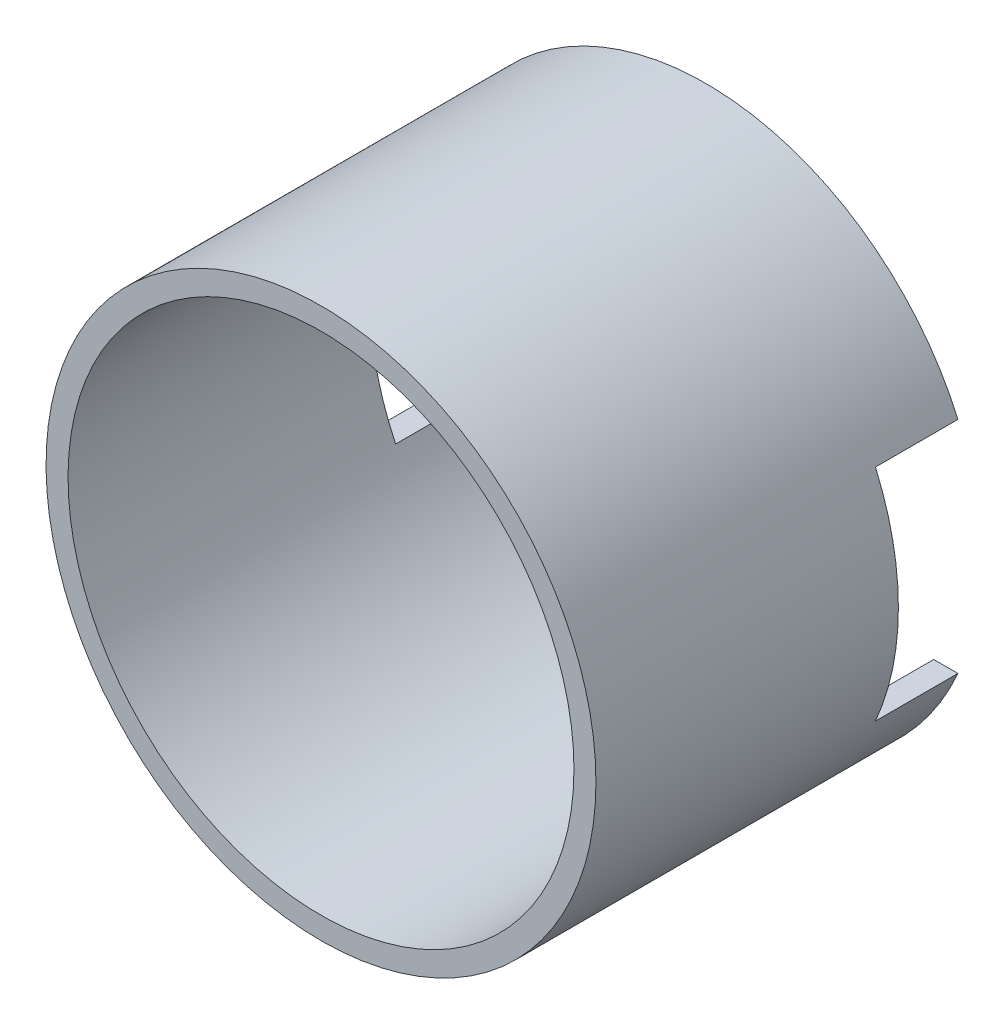
ISO-10303-21;
HEADER;
FILE_DESCRIPTION(('STEP AP214'),'2;1');
FILE_NAME('part.step','',(''),(''),'','','');
FILE_SCHEMA(('AUTOMOTIVE_DESIGN { 1 0 10303 214 1 1 1 1 }'));
ENDSEC;
DATA;
#1=APPLICATION_CONTEXT('core data for automotive mechanical design processes');
#2=APPLICATION_PROTOCOL_DEFINITION('international standard','automotive_design',2000,#1);
#3=PRODUCT_CONTEXT('',#1,'mechanical');
#4=PRODUCT('Part','Part','',(#3));
#5=PRODUCT_RELATED_PRODUCT_CATEGORY('part','',(#4));
#6=PRODUCT_DEFINITION_FORMATION('','',#4);
#7=PRODUCT_DEFINITION_CONTEXT('part definition',#1,'design');
#8=PRODUCT_DEFINITION('design','',#6,#7);
#9=PRODUCT_DEFINITION_SHAPE('','',#8);
#10=(LENGTH_UNIT() NAMED_UNIT(*) SI_UNIT(.MILLI.,.METRE.));
#11=(NAMED_UNIT(*) PLANE_ANGLE_UNIT() SI_UNIT($,.RADIAN.));
#12=(NAMED_UNIT(*) SI_UNIT($,.STERADIAN.) SOLID_ANGLE_UNIT());
#13=UNCERTAINTY_MEASURE_WITH_UNIT(LENGTH_MEASURE(1.E-05),#10,'distance_accuracy_value','');
#14=(GEOMETRIC_REPRESENTATION_CONTEXT(3) GLOBAL_UNCERTAINTY_ASSIGNED_CONTEXT((#13)) GLOBAL_UNIT_ASSIGNED_CONTEXT((#10,
#11,#12)) REPRESENTATION_CONTEXT('',''));
#15=CARTESIAN_POINT('',(0.,0.,0.));
#16=DIRECTION('',(0.,0.,1.));
#17=DIRECTION('',(1.,0.,0.));
#18=AXIS2_PLACEMENT_3D('',#15,#16,#17);
#19=CARTESIAN_POINT('',(0.,0.,0.));
#20=DIRECTION('',(0.,0.,1.));
#21=DIRECTION('',(1.,0.,0.));
#22=AXIS2_PLACEMENT_3D('',#19,#20,#21);
#23=PLANE('',#22);
#24=DIRECTION('',(-1.,0.,0.));
#25=VECTOR('',#24,1.);
#26=CARTESIAN_POINT('',(0.,-6.,0.));
#27=LINE('',#26,#25);
#28=CARTESIAN_POINT('',(13.7477270848675,-6.,0.));
#29=VERTEX_POINT('',#28);
#30=CARTESIAN_POINT('',(12.4273891063248,-6.,0.));
#31=VERTEX_POINT('',#30);
#32=EDGE_CURVE('E171',#29,#31,#27,.T.);
#33=ORIENTED_EDGE('',*,*,#32,.F.);
#34=CARTESIAN_POINT('',(0.,0.,0.));
#35=DIRECTION('',(0.,0.,1.));
#36=DIRECTION('',(1.,0.,0.));
#37=AXIS2_PLACEMENT_3D('',#34,#35,#36);
#38=CIRCLE('',#37,15.);
#39=CARTESIAN_POINT('',(-13.7477270848675,-6.,0.));
#40=VERTEX_POINT('',#39);
#41=EDGE_CURVE('E134',#40,#29,#38,.T.);
#42=ORIENTED_EDGE('',*,*,#41,.F.);
#43=CARTESIAN_POINT('',(-12.4273891063248,-6.,0.));
#44=VERTEX_POINT('',#43);
#45=EDGE_CURVE('E170',#44,#40,#27,.T.);
#46=ORIENTED_EDGE('',*,*,#45,.F.);
#47=CARTESIAN_POINT('',(0.,0.,0.));
#48=DIRECTION('',(0.,0.,1.));
#49=DIRECTION('',(1.,0.,0.));
#50=AXIS2_PLACEMENT_3D('',#47,#48,#49);
#51=CIRCLE('',#50,13.8);
#52=EDGE_CURVE('E123',#44,#31,#51,.T.);
#53=ORIENTED_EDGE('',*,*,#52,.T.);
#54=EDGE_LOOP('',(#33,#42,#46,#53));
#55=FACE_BOUND('',#54,.T.);
#56=ADVANCED_FACE('F36',(#55),#23,.F.);
#57=DIRECTION('',(1.,0.,0.));
#58=VECTOR('',#57,1.);
#59=CARTESIAN_POINT('',(0.,6.,0.));
#60=LINE('',#59,#58);
#61=CARTESIAN_POINT('',(-13.7477270848675,6.,0.));
#62=VERTEX_POINT('',#61);
#63=CARTESIAN_POINT('',(-12.4273891063248,6.,0.));
#64=VERTEX_POINT('',#63);
#65=EDGE_CURVE('E59',#62,#64,#60,.T.);
#66=ORIENTED_EDGE('',*,*,#65,.F.);
#67=CARTESIAN_POINT('',(13.7477270848675,6.,0.));
#68=VERTEX_POINT('',#67);
#69=EDGE_CURVE('E141',#68,#62,#38,.T.);
#70=ORIENTED_EDGE('',*,*,#69,.F.);
#71=CARTESIAN_POINT('',(12.4273891063248,5.99999999999999,0.));
#72=VERTEX_POINT('',#71);
#73=EDGE_CURVE('E102',#72,#68,#60,.T.);
#74=ORIENTED_EDGE('',*,*,#73,.F.);
#75=EDGE_CURVE('E127',#72,#64,#51,.T.);
#76=ORIENTED_EDGE('',*,*,#75,.T.);
#77=EDGE_LOOP('',(#66,#70,#74,#76));
#78=FACE_BOUND('',#77,.T.);
#79=ADVANCED_FACE('F180',(#78),#23,.F.);
#80=CARTESIAN_POINT('',(0.,0.,21.));
#81=DIRECTION('',(0.,0.,-1.));
#82=DIRECTION('',(-1.,0.,0.));
#83=AXIS2_PLACEMENT_3D('',#80,#81,#82);
#84=CYLINDRICAL_SURFACE('',#83,15.);
#85=CARTESIAN_POINT('',(0.,0.,21.));
#86=DIRECTION('',(0.,0.,1.));
#87=DIRECTION('',(1.,0.,0.));
#88=AXIS2_PLACEMENT_3D('',#85,#86,#87);
#89=CIRCLE('',#88,15.);
#90=CARTESIAN_POINT('',(15.,0.,21.));
#91=VERTEX_POINT('',#90);
#92=EDGE_CURVE('E137',#91,#91,#89,.T.);
#93=ORIENTED_EDGE('',*,*,#92,.F.);
#94=EDGE_LOOP('',(#93));
#95=FACE_BOUND('',#94,.T.);
#96=DIRECTION('',(0.,0.,-1.));
#97=VECTOR('',#96,1.);
#98=CARTESIAN_POINT('',(-13.7477270848675,-6.,21.));
#99=LINE('',#98,#97);
#100=CARTESIAN_POINT('',(-13.7477270848675,-6.,4.5));
#101=VERTEX_POINT('',#100);
#102=EDGE_CURVE('E163',#40,#101,#99,.F.);
#103=ORIENTED_EDGE('',*,*,#102,.F.);
#104=ORIENTED_EDGE('',*,*,#41,.T.);
#105=DIRECTION('',(0.,0.,-1.));
#106=VECTOR('',#105,1.);
#107=CARTESIAN_POINT('',(13.7477270848675,-6.,21.));
#108=LINE('',#107,#106);
#109=CARTESIAN_POINT('',(13.7477270848675,-6.,4.5));
#110=VERTEX_POINT('',#109);
#111=EDGE_CURVE('E122',#110,#29,#108,.T.);
#112=ORIENTED_EDGE('',*,*,#111,.F.);
#113=CARTESIAN_POINT('',(0.,0.,4.5));
#114=DIRECTION('',(0.,0.,-1.));
#115=DIRECTION('',(-1.,0.,0.));
#116=AXIS2_PLACEMENT_3D('',#113,#114,#115);
#117=CIRCLE('',#116,15.);
#118=CARTESIAN_POINT('',(13.7477270848675,6.,4.5));
#119=VERTEX_POINT('',#118);
#120=EDGE_CURVE('E111',#119,#110,#117,.T.);
#121=ORIENTED_EDGE('',*,*,#120,.F.);
#122=DIRECTION('',(0.,0.,-1.));
#123=VECTOR('',#122,1.);
#124=CARTESIAN_POINT('',(13.7477270848675,5.99999999999999,21.));
#125=LINE('',#124,#123);
#126=EDGE_CURVE('E99',#68,#119,#125,.F.);
#127=ORIENTED_EDGE('',*,*,#126,.F.);
#128=ORIENTED_EDGE('',*,*,#69,.T.);
#129=DIRECTION('',(0.,0.,-1.));
#130=VECTOR('',#129,1.);
#131=CARTESIAN_POINT('',(-13.7477270848675,5.99999999999999,21.));
#132=LINE('',#131,#130);
#133=CARTESIAN_POINT('',(-13.7477270848675,6.,4.5));
#134=VERTEX_POINT('',#133);
#135=EDGE_CURVE('E168',#134,#62,#132,.T.);
#136=ORIENTED_EDGE('',*,*,#135,.F.);
#137=EDGE_CURVE('E124',#101,#134,#117,.T.);
#138=ORIENTED_EDGE('',*,*,#137,.F.);
#139=EDGE_LOOP('',(#103,#104,#112,#121,#127,#128,#136,#138));
#140=FACE_BOUND('',#139,.T.);
#141=ADVANCED_FACE('F38',(#95,#140),#84,.T.);
#142=CARTESIAN_POINT('',(0.,0.,21.));
#143=DIRECTION('',(0.,0.,-1.));
#144=DIRECTION('',(-1.,0.,0.));
#145=AXIS2_PLACEMENT_3D('',#142,#143,#144);
#146=CYLINDRICAL_SURFACE('',#145,13.8);
#147=CARTESIAN_POINT('',(0.,0.,21.));
#148=DIRECTION('',(0.,0.,1.));
#149=DIRECTION('',(1.,0.,0.));
#150=AXIS2_PLACEMENT_3D('',#147,#148,#149);
#151=CIRCLE('',#150,13.8);
#152=CARTESIAN_POINT('',(13.8,0.,21.));
#153=VERTEX_POINT('',#152);
#154=EDGE_CURVE('E132',#153,#153,#151,.T.);
#155=ORIENTED_EDGE('',*,*,#154,.T.);
#156=EDGE_LOOP('',(#155));
#157=FACE_BOUND('',#156,.T.);
#158=ORIENTED_EDGE('',*,*,#52,.F.);
#159=DIRECTION('',(0.,0.,-1.));
#160=VECTOR('',#159,1.);
#161=CARTESIAN_POINT('',(-12.4273891063248,-6.,21.));
#162=LINE('',#161,#160);
#163=CARTESIAN_POINT('',(-12.4273891063248,-6.,4.5));
#164=VERTEX_POINT('',#163);
#165=EDGE_CURVE('E11',#44,#164,#162,.F.);
#166=ORIENTED_EDGE('',*,*,#165,.T.);
#167=CARTESIAN_POINT('',(0.,0.,4.5));
#168=DIRECTION('',(0.,0.,-1.));
#169=DIRECTION('',(-1.,0.,0.));
#170=AXIS2_PLACEMENT_3D('',#167,#168,#169);
#171=CIRCLE('',#170,13.8);
#172=CARTESIAN_POINT('',(-12.4273891063248,6.,4.5));
#173=VERTEX_POINT('',#172);
#174=EDGE_CURVE('E44',#164,#173,#171,.T.);
#175=ORIENTED_EDGE('',*,*,#174,.T.);
#176=DIRECTION('',(0.,0.,-1.));
#177=VECTOR('',#176,1.);
#178=CARTESIAN_POINT('',(-12.4273891063248,5.99999999999999,21.));
#179=LINE('',#178,#177);
#180=EDGE_CURVE('E147',#173,#64,#179,.T.);
#181=ORIENTED_EDGE('',*,*,#180,.T.);
#182=ORIENTED_EDGE('',*,*,#75,.F.);
#183=DIRECTION('',(0.,0.,-1.));
#184=VECTOR('',#183,1.);
#185=CARTESIAN_POINT('',(12.4273891063248,5.99999999999999,21.));
#186=LINE('',#185,#184);
#187=CARTESIAN_POINT('',(12.4273891063248,5.99999999999999,4.5));
#188=VERTEX_POINT('',#187);
#189=EDGE_CURVE('E140',#72,#188,#186,.F.);
#190=ORIENTED_EDGE('',*,*,#189,.T.);
#191=CARTESIAN_POINT('',(12.4273891063248,-6.,4.5));
#192=VERTEX_POINT('',#191);
#193=EDGE_CURVE('E114',#188,#192,#171,.T.);
#194=ORIENTED_EDGE('',*,*,#193,.T.);
#195=DIRECTION('',(0.,0.,-1.));
#196=VECTOR('',#195,1.);
#197=CARTESIAN_POINT('',(12.4273891063248,-6.,21.));
#198=LINE('',#197,#196);
#199=EDGE_CURVE('E145',#192,#31,#198,.T.);
#200=ORIENTED_EDGE('',*,*,#199,.T.);
#201=EDGE_LOOP('',(#158,#166,#175,#181,#182,#190,#194,#200));
#202=FACE_BOUND('',#201,.T.);
#203=ADVANCED_FACE('F152',(#157,#202),#146,.F.);
#204=CARTESIAN_POINT('',(0.,0.,21.));
#205=DIRECTION('',(0.,0.,1.));
#206=DIRECTION('',(1.,0.,0.));
#207=AXIS2_PLACEMENT_3D('',#204,#205,#206);
#208=PLANE('',#207);
#209=ORIENTED_EDGE('',*,*,#92,.T.);
#210=EDGE_LOOP('',(#209));
#211=FACE_BOUND('',#210,.T.);
#212=ORIENTED_EDGE('',*,*,#154,.F.);
#213=EDGE_LOOP('',(#212));
#214=FACE_BOUND('',#213,.T.);
#215=ADVANCED_FACE('F188',(#211,#214),#208,.T.);
#216=CARTESIAN_POINT('',(21.,-6.,-4.5));
#217=DIRECTION('',(0.,1.,0.));
#218=DIRECTION('',(0.,0.,1.));
#219=AXIS2_PLACEMENT_3D('',#216,#217,#218);
#220=PLANE('',#219);
#221=ORIENTED_EDGE('',*,*,#111,.T.);
#222=ORIENTED_EDGE('',*,*,#32,.T.);
#223=ORIENTED_EDGE('',*,*,#199,.F.);
#224=DIRECTION('',(-1.,0.,0.));
#225=VECTOR('',#224,1.);
#226=CARTESIAN_POINT('',(21.,-6.,4.5));
#227=LINE('',#226,#225);
#228=EDGE_CURVE('E164',#110,#192,#227,.T.);
#229=ORIENTED_EDGE('',*,*,#228,.F.);
#230=EDGE_LOOP('',(#221,#222,#223,#229));
#231=FACE_BOUND('',#230,.T.);
#232=ADVANCED_FACE('F174',(#231),#220,.T.);
#233=CARTESIAN_POINT('',(21.,6.,-4.5));
#234=DIRECTION('',(0.,-1.,0.));
#235=DIRECTION('',(0.,0.,-1.));
#236=AXIS2_PLACEMENT_3D('',#233,#234,#235);
#237=PLANE('',#236);
#238=ORIENTED_EDGE('',*,*,#126,.T.);
#239=DIRECTION('',(-1.,0.,0.));
#240=VECTOR('',#239,1.);
#241=CARTESIAN_POINT('',(21.,6.,4.5));
#242=LINE('',#241,#240);
#243=EDGE_CURVE('E51',#119,#188,#242,.T.);
#244=ORIENTED_EDGE('',*,*,#243,.T.);
#245=ORIENTED_EDGE('',*,*,#189,.F.);
#246=ORIENTED_EDGE('',*,*,#73,.T.);
#247=EDGE_LOOP('',(#238,#244,#245,#246));
#248=FACE_BOUND('',#247,.T.);
#249=ADVANCED_FACE('F100',(#248),#237,.T.);
#250=CARTESIAN_POINT('',(21.,-6.,4.5));
#251=DIRECTION('',(0.,0.,-1.));
#252=DIRECTION('',(-1.,0.,0.));
#253=AXIS2_PLACEMENT_3D('',#250,#251,#252);
#254=PLANE('',#253);
#255=ORIENTED_EDGE('',*,*,#120,.T.);
#256=ORIENTED_EDGE('',*,*,#228,.T.);
#257=ORIENTED_EDGE('',*,*,#193,.F.);
#258=ORIENTED_EDGE('',*,*,#243,.F.);
#259=EDGE_LOOP('',(#255,#256,#257,#258));
#260=FACE_BOUND('',#259,.T.);
#261=ADVANCED_FACE('F109',(#260),#254,.T.);
#262=ORIENTED_EDGE('',*,*,#137,.T.);
#263=EDGE_CURVE('E117',#173,#134,#242,.T.);
#264=ORIENTED_EDGE('',*,*,#263,.F.);
#265=ORIENTED_EDGE('',*,*,#174,.F.);
#266=EDGE_CURVE('E116',#164,#101,#227,.T.);
#267=ORIENTED_EDGE('',*,*,#266,.T.);
#268=EDGE_LOOP('',(#262,#264,#265,#267));
#269=FACE_BOUND('',#268,.T.);
#270=ADVANCED_FACE('F157',(#269),#254,.T.);
#271=ORIENTED_EDGE('',*,*,#102,.T.);
#272=ORIENTED_EDGE('',*,*,#266,.F.);
#273=ORIENTED_EDGE('',*,*,#165,.F.);
#274=ORIENTED_EDGE('',*,*,#45,.T.);
#275=EDGE_LOOP('',(#271,#272,#273,#274));
#276=FACE_BOUND('',#275,.T.);
#277=ADVANCED_FACE('F161',(#276),#220,.T.);
#278=ORIENTED_EDGE('',*,*,#135,.T.);
#279=ORIENTED_EDGE('',*,*,#65,.T.);
#280=ORIENTED_EDGE('',*,*,#180,.F.);
#281=ORIENTED_EDGE('',*,*,#263,.T.);
#282=EDGE_LOOP('',(#278,#279,#280,#281));
#283=FACE_BOUND('',#282,.T.);
#284=ADVANCED_FACE('F178',(#283),#237,.T.);
#285=CLOSED_SHELL('',(#56,#79,#141,#203,#215,#232,#249,#261,#270,#277,#284));
#286=MANIFOLD_SOLID_BREP('B2',#285);
#287=ADVANCED_BREP_SHAPE_REPRESENTATION('',(#18,#286),#14);
#288=SHAPE_DEFINITION_REPRESENTATION(#9,#287);
ENDSEC;
END-ISO-10303-21;
